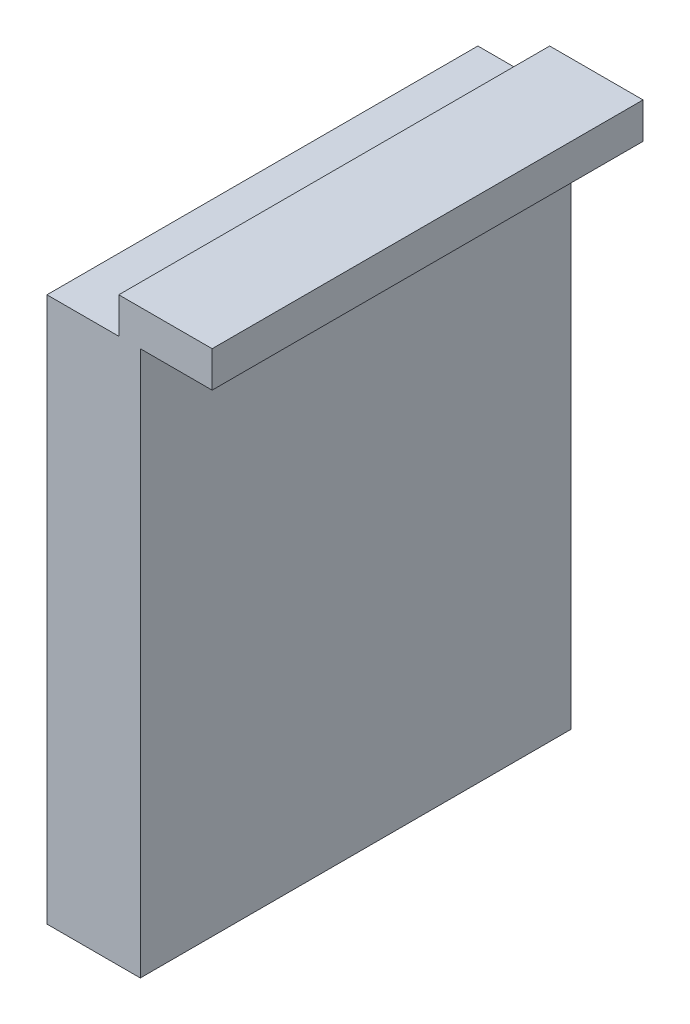
ISO-10303-21;
HEADER;
FILE_DESCRIPTION(('STEP AP214'),'2;1');
FILE_NAME('part.step','',(''),(''),'','','');
FILE_SCHEMA(('AUTOMOTIVE_DESIGN { 1 0 10303 214 1 1 1 1 }'));
ENDSEC;
DATA;
#1=APPLICATION_CONTEXT('core data for automotive mechanical design processes');
#2=APPLICATION_PROTOCOL_DEFINITION('international standard','automotive_design',2000,#1);
#3=PRODUCT_CONTEXT('',#1,'mechanical');
#4=PRODUCT('Part','Part','',(#3));
#5=PRODUCT_RELATED_PRODUCT_CATEGORY('part','',(#4));
#6=PRODUCT_DEFINITION_FORMATION('','',#4);
#7=PRODUCT_DEFINITION_CONTEXT('part definition',#1,'design');
#8=PRODUCT_DEFINITION('design','',#6,#7);
#9=PRODUCT_DEFINITION_SHAPE('','',#8);
#10=(LENGTH_UNIT() NAMED_UNIT(*) SI_UNIT(.MILLI.,.METRE.));
#11=(NAMED_UNIT(*) PLANE_ANGLE_UNIT() SI_UNIT($,.RADIAN.));
#12=(NAMED_UNIT(*) SI_UNIT($,.STERADIAN.) SOLID_ANGLE_UNIT());
#13=UNCERTAINTY_MEASURE_WITH_UNIT(LENGTH_MEASURE(1.E-05),#10,'distance_accuracy_value','');
#14=(GEOMETRIC_REPRESENTATION_CONTEXT(3) GLOBAL_UNCERTAINTY_ASSIGNED_CONTEXT((#13)) GLOBAL_UNIT_ASSIGNED_CONTEXT((#10,
#11,#12)) REPRESENTATION_CONTEXT('',''));
#15=CARTESIAN_POINT('',(0.,0.,0.));
#16=DIRECTION('',(0.,0.,1.));
#17=DIRECTION('',(1.,0.,0.));
#18=AXIS2_PLACEMENT_3D('',#15,#16,#17);
#19=CARTESIAN_POINT('',(-492.563683395295,0.,0.));
#20=DIRECTION('',(-1.,0.,0.));
#21=DIRECTION('',(0.,0.,1.));
#22=AXIS2_PLACEMENT_3D('',#19,#20,#21);
#23=PLANE('',#22);
#24=CARTESIAN_POINT('',(-492.563683395295,153.392316887264,15.));
#25=DIRECTION('',(-1.,0.,0.));
#26=DIRECTION('',(0.,0.,1.));
#27=AXIS2_PLACEMENT_3D('',#24,#25,#26);
#28=CIRCLE('',#27,2.05);
#29=CARTESIAN_POINT('',(-492.563683395295,153.392316887264,17.05));
#30=VERTEX_POINT('',#29);
#31=EDGE_CURVE('E11',#30,#30,#28,.T.);
#32=ORIENTED_EDGE('',*,*,#31,.F.);
#33=EDGE_LOOP('',(#32));
#34=FACE_BOUND('',#33,.T.);
#35=DIRECTION('',(0.,0.,-1.));
#36=VECTOR('',#35,1.);
#37=CARTESIAN_POINT('',(-492.563683395295,171.113943122571,30.));
#38=LINE('',#37,#36);
#39=CARTESIAN_POINT('',(-492.563683395295,171.113943122571,30.));
#40=VERTEX_POINT('',#39);
#41=CARTESIAN_POINT('',(-492.563683395295,171.113943122571,0.));
#42=VERTEX_POINT('',#41);
#43=EDGE_CURVE('E114',#40,#42,#38,.T.);
#44=ORIENTED_EDGE('',*,*,#43,.T.);
#45=DIRECTION('',(0.,-1.,0.));
#46=VECTOR('',#45,1.);
#47=CARTESIAN_POINT('',(-492.563683395295,171.113943122571,0.));
#48=LINE('',#47,#46);
#49=CARTESIAN_POINT('',(-492.563683395295,133.170690651959,0.));
#50=VERTEX_POINT('',#49);
#51=EDGE_CURVE('E108',#42,#50,#48,.T.);
#52=ORIENTED_EDGE('',*,*,#51,.T.);
#53=DIRECTION('',(0.,0.,-1.));
#54=VECTOR('',#53,1.);
#55=CARTESIAN_POINT('',(-492.563683395295,133.170690651959,30.));
#56=LINE('',#55,#54);
#57=CARTESIAN_POINT('',(-492.563683395295,133.170690651959,30.));
#58=VERTEX_POINT('',#57);
#59=EDGE_CURVE('E93',#58,#50,#56,.T.);
#60=ORIENTED_EDGE('',*,*,#59,.F.);
#61=DIRECTION('',(0.,-1.,0.));
#62=VECTOR('',#61,1.);
#63=CARTESIAN_POINT('',(-492.563683395295,171.113943122571,30.));
#64=LINE('',#63,#62);
#65=EDGE_CURVE('E101',#40,#58,#64,.T.);
#66=ORIENTED_EDGE('',*,*,#65,.F.);
#67=EDGE_LOOP('',(#44,#52,#60,#66));
#68=FACE_BOUND('',#67,.T.);
#69=ADVANCED_FACE('F32',(#34,#68),#23,.T.);
#70=CARTESIAN_POINT('',(-439.193337024311,171.113943122571,0.));
#71=DIRECTION('',(0.,0.,-1.));
#72=DIRECTION('',(-1.,0.,0.));
#73=AXIS2_PLACEMENT_3D('',#70,#71,#72);
#74=PLANE('',#73);
#75=DIRECTION('',(-1.,0.,0.));
#76=VECTOR('',#75,1.);
#77=CARTESIAN_POINT('',(-439.193337024311,171.113943122571,0.));
#78=LINE('',#77,#76);
#79=CARTESIAN_POINT('',(-487.563683395295,171.113943122571,0.));
#80=VERTEX_POINT('',#79);
#81=EDGE_CURVE('E36',#80,#42,#78,.T.);
#82=ORIENTED_EDGE('',*,*,#81,.F.);
#83=DIRECTION('',(-1.55100287586667E-13,1.,0.));
#84=VECTOR('',#83,1.);
#85=CARTESIAN_POINT('',(-487.563683395295,173.613943122571,0.));
#86=LINE('',#85,#84);
#87=CARTESIAN_POINT('',(-487.563683395295,173.613943122571,0.));
#88=VERTEX_POINT('',#87);
#89=EDGE_CURVE('E71',#80,#88,#86,.T.);
#90=ORIENTED_EDGE('',*,*,#89,.T.);
#91=DIRECTION('',(-1.,-1.55431223447522E-13,0.));
#92=VECTOR('',#91,1.);
#93=CARTESIAN_POINT('',(-486.063683395295,173.613943122571,0.));
#94=LINE('',#93,#92);
#95=CARTESIAN_POINT('',(-481.063683395295,173.613943122572,0.));
#96=VERTEX_POINT('',#95);
#97=EDGE_CURVE('E116',#96,#88,#94,.T.);
#98=ORIENTED_EDGE('',*,*,#97,.F.);
#99=DIRECTION('',(-1.55431223447524E-13,1.,0.));
#100=VECTOR('',#99,1.);
#101=CARTESIAN_POINT('',(-481.063683395295,173.613943122572,0.));
#102=LINE('',#101,#100);
#103=CARTESIAN_POINT('',(-481.063683395295,171.113943122572,0.));
#104=VERTEX_POINT('',#103);
#105=EDGE_CURVE('E204',#104,#96,#102,.T.);
#106=ORIENTED_EDGE('',*,*,#105,.F.);
#107=DIRECTION('',(-1.,-1.55100287586667E-13,0.));
#108=VECTOR('',#107,1.);
#109=CARTESIAN_POINT('',(-481.063683395295,171.113943122572,0.));
#110=LINE('',#109,#108);
#111=CARTESIAN_POINT('',(-486.063683395295,171.113943122571,0.));
#112=VERTEX_POINT('',#111);
#113=EDGE_CURVE('E206',#104,#112,#110,.T.);
#114=ORIENTED_EDGE('',*,*,#113,.T.);
#115=DIRECTION('',(-1.55100287586667E-13,1.,0.));
#116=VECTOR('',#115,1.);
#117=CARTESIAN_POINT('',(-486.063683395295,173.613943122571,0.));
#118=LINE('',#117,#116);
#119=CARTESIAN_POINT('',(-486.063683395289,133.170690651959,0.));
#120=VERTEX_POINT('',#119);
#121=EDGE_CURVE('E120',#120,#112,#118,.T.);
#122=ORIENTED_EDGE('',*,*,#121,.F.);
#123=DIRECTION('',(-1.,0.,0.));
#124=VECTOR('',#123,1.);
#125=CARTESIAN_POINT('',(-439.193337024311,133.170690651959,0.));
#126=LINE('',#125,#124);
#127=EDGE_CURVE('E98',#120,#50,#126,.T.);
#128=ORIENTED_EDGE('',*,*,#127,.T.);
#129=ORIENTED_EDGE('',*,*,#51,.F.);
#130=EDGE_LOOP('',(#82,#90,#98,#106,#114,#122,#128,#129));
#131=FACE_BOUND('',#130,.T.);
#132=ADVANCED_FACE('F34',(#131),#74,.T.);
#133=CARTESIAN_POINT('',(-439.193337024311,133.170690651959,30.));
#134=DIRECTION('',(0.,1.,0.));
#135=DIRECTION('',(0.,0.,1.));
#136=AXIS2_PLACEMENT_3D('',#133,#134,#135);
#137=PLANE('',#136);
#138=ORIENTED_EDGE('',*,*,#127,.F.);
#139=DIRECTION('',(0.,0.,-1.));
#140=VECTOR('',#139,1.);
#141=CARTESIAN_POINT('',(-486.063683395289,133.170690651959,30.));
#142=LINE('',#141,#140);
#143=CARTESIAN_POINT('',(-486.063683395289,133.170690651959,30.));
#144=VERTEX_POINT('',#143);
#145=EDGE_CURVE('E96',#144,#120,#142,.T.);
#146=ORIENTED_EDGE('',*,*,#145,.F.);
#147=DIRECTION('',(-1.,0.,0.));
#148=VECTOR('',#147,1.);
#149=CARTESIAN_POINT('',(-439.193337024311,133.170690651959,30.));
#150=LINE('',#149,#148);
#151=EDGE_CURVE('E89',#144,#58,#150,.T.);
#152=ORIENTED_EDGE('',*,*,#151,.T.);
#153=ORIENTED_EDGE('',*,*,#59,.T.);
#154=EDGE_LOOP('',(#138,#146,#152,#153));
#155=FACE_BOUND('',#154,.T.);
#156=ADVANCED_FACE('F91',(#155),#137,.F.);
#157=CARTESIAN_POINT('',(-439.193337024311,171.113943122571,30.));
#158=DIRECTION('',(0.,0.,-1.));
#159=DIRECTION('',(0.,1.,0.));
#160=AXIS2_PLACEMENT_3D('',#157,#158,#159);
#161=PLANE('',#160);
#162=ORIENTED_EDGE('',*,*,#151,.F.);
#163=DIRECTION('',(1.55100287586667E-13,-1.,0.));
#164=VECTOR('',#163,1.);
#165=CARTESIAN_POINT('',(-486.063683395295,173.613943122571,30.));
#166=LINE('',#165,#164);
#167=CARTESIAN_POINT('',(-486.063683395295,171.113943122571,30.));
#168=VERTEX_POINT('',#167);
#169=EDGE_CURVE('E123',#168,#144,#166,.T.);
#170=ORIENTED_EDGE('',*,*,#169,.F.);
#171=DIRECTION('',(-1.,-1.55100287586667E-13,0.));
#172=VECTOR('',#171,1.);
#173=CARTESIAN_POINT('',(-481.063683395295,171.113943122572,30.));
#174=LINE('',#173,#172);
#175=CARTESIAN_POINT('',(-481.063683395295,171.113943122572,30.));
#176=VERTEX_POINT('',#175);
#177=EDGE_CURVE('E133',#176,#168,#174,.T.);
#178=ORIENTED_EDGE('',*,*,#177,.F.);
#179=DIRECTION('',(1.55431223447524E-13,-1.,0.));
#180=VECTOR('',#179,1.);
#181=CARTESIAN_POINT('',(-481.063683395295,173.613943122572,30.));
#182=LINE('',#181,#180);
#183=CARTESIAN_POINT('',(-481.063683395295,173.613943122572,30.));
#184=VERTEX_POINT('',#183);
#185=EDGE_CURVE('E196',#184,#176,#182,.T.);
#186=ORIENTED_EDGE('',*,*,#185,.F.);
#187=DIRECTION('',(-1.,-1.55431223447522E-13,0.));
#188=VECTOR('',#187,1.);
#189=CARTESIAN_POINT('',(-486.063683395295,173.613943122571,30.));
#190=LINE('',#189,#188);
#191=CARTESIAN_POINT('',(-487.563683395295,173.613943122571,30.));
#192=VERTEX_POINT('',#191);
#193=EDGE_CURVE('E125',#184,#192,#190,.T.);
#194=ORIENTED_EDGE('',*,*,#193,.T.);
#195=DIRECTION('',(1.55100287586667E-13,-1.,0.));
#196=VECTOR('',#195,1.);
#197=CARTESIAN_POINT('',(-487.563683395295,173.613943122571,30.));
#198=LINE('',#197,#196);
#199=CARTESIAN_POINT('',(-487.563683395295,171.113943122571,30.));
#200=VERTEX_POINT('',#199);
#201=EDGE_CURVE('E131',#192,#200,#198,.T.);
#202=ORIENTED_EDGE('',*,*,#201,.T.);
#203=DIRECTION('',(-1.,0.,0.));
#204=VECTOR('',#203,1.);
#205=CARTESIAN_POINT('',(-439.193337024311,171.113943122571,30.));
#206=LINE('',#205,#204);
#207=EDGE_CURVE('E104',#200,#40,#206,.T.);
#208=ORIENTED_EDGE('',*,*,#207,.T.);
#209=ORIENTED_EDGE('',*,*,#65,.T.);
#210=EDGE_LOOP('',(#162,#170,#178,#186,#194,#202,#208,#209));
#211=FACE_BOUND('',#210,.T.);
#212=ADVANCED_FACE('F102',(#211),#161,.F.);
#213=CARTESIAN_POINT('',(-439.193337024311,171.113943122571,30.));
#214=DIRECTION('',(0.,1.,0.));
#215=DIRECTION('',(0.,0.,1.));
#216=AXIS2_PLACEMENT_3D('',#213,#214,#215);
#217=PLANE('',#216);
#218=ORIENTED_EDGE('',*,*,#207,.F.);
#219=DIRECTION('',(0.,0.,-1.));
#220=VECTOR('',#219,1.);
#221=CARTESIAN_POINT('',(-487.563683395295,171.113943122571,30.));
#222=LINE('',#221,#220);
#223=EDGE_CURVE('E76',#200,#80,#222,.T.);
#224=ORIENTED_EDGE('',*,*,#223,.T.);
#225=ORIENTED_EDGE('',*,*,#81,.T.);
#226=ORIENTED_EDGE('',*,*,#43,.F.);
#227=EDGE_LOOP('',(#218,#224,#225,#226));
#228=FACE_BOUND('',#227,.T.);
#229=ADVANCED_FACE('F153',(#228),#217,.T.);
#230=CARTESIAN_POINT('',(-486.063683395295,173.613943122571,30.));
#231=DIRECTION('',(1.55431223447522E-13,-1.,0.));
#232=DIRECTION('',(1.,1.55431223447522E-13,0.));
#233=AXIS2_PLACEMENT_3D('',#230,#231,#232);
#234=PLANE('',#233);
#235=DIRECTION('',(0.,0.,1.));
#236=VECTOR('',#235,1.);
#237=CARTESIAN_POINT('',(-487.563683395295,173.613943122571,30.));
#238=LINE('',#237,#236);
#239=EDGE_CURVE('E127',#88,#192,#238,.T.);
#240=ORIENTED_EDGE('',*,*,#239,.T.);
#241=ORIENTED_EDGE('',*,*,#193,.F.);
#242=DIRECTION('',(0.,0.,1.));
#243=VECTOR('',#242,1.);
#244=CARTESIAN_POINT('',(-481.063683395295,173.613943122572,30.));
#245=LINE('',#244,#243);
#246=EDGE_CURVE('E147',#96,#184,#245,.T.);
#247=ORIENTED_EDGE('',*,*,#246,.F.);
#248=ORIENTED_EDGE('',*,*,#97,.T.);
#249=EDGE_LOOP('',(#240,#241,#247,#248));
#250=FACE_BOUND('',#249,.T.);
#251=ADVANCED_FACE('F143',(#250),#234,.F.);
#252=CARTESIAN_POINT('',(-486.063683395268,-7.53881206762493E-11,0.));
#253=DIRECTION('',(1.,1.55100287586667E-13,0.));
#254=DIRECTION('',(-1.55100287586667E-13,1.,0.));
#255=AXIS2_PLACEMENT_3D('',#252,#253,#254);
#256=PLANE('',#255);
#257=DIRECTION('',(0.,0.,-1.));
#258=VECTOR('',#257,1.);
#259=CARTESIAN_POINT('',(-486.063683395295,171.113943122571,30.));
#260=LINE('',#259,#258);
#261=EDGE_CURVE('E48',#168,#112,#260,.T.);
#262=ORIENTED_EDGE('',*,*,#261,.F.);
#263=ORIENTED_EDGE('',*,*,#169,.T.);
#264=ORIENTED_EDGE('',*,*,#145,.T.);
#265=ORIENTED_EDGE('',*,*,#121,.T.);
#266=EDGE_LOOP('',(#262,#263,#264,#265));
#267=FACE_BOUND('',#266,.T.);
#268=ADVANCED_FACE('F121',(#267),#256,.T.);
#269=CARTESIAN_POINT('',(-487.563683395268,-7.56212675114206E-11,0.));
#270=DIRECTION('',(1.,1.55100287586667E-13,0.));
#271=DIRECTION('',(-1.55100287586667E-13,1.,0.));
#272=AXIS2_PLACEMENT_3D('',#269,#270,#271);
#273=PLANE('',#272);
#274=ORIENTED_EDGE('',*,*,#223,.F.);
#275=ORIENTED_EDGE('',*,*,#201,.F.);
#276=ORIENTED_EDGE('',*,*,#239,.F.);
#277=ORIENTED_EDGE('',*,*,#89,.F.);
#278=EDGE_LOOP('',(#274,#275,#276,#277));
#279=FACE_BOUND('',#278,.T.);
#280=ADVANCED_FACE('F151',(#279),#273,.F.);
#281=CARTESIAN_POINT('',(-481.063683395295,171.113943122572,30.));
#282=DIRECTION('',(-1.55100287586667E-13,1.,0.));
#283=DIRECTION('',(-1.,-1.55100287586667E-13,0.));
#284=AXIS2_PLACEMENT_3D('',#281,#282,#283);
#285=PLANE('',#284);
#286=ORIENTED_EDGE('',*,*,#261,.T.);
#287=ORIENTED_EDGE('',*,*,#113,.F.);
#288=DIRECTION('',(0.,0.,-1.));
#289=VECTOR('',#288,1.);
#290=CARTESIAN_POINT('',(-481.063683395295,171.113943122572,30.));
#291=LINE('',#290,#289);
#292=EDGE_CURVE('E201',#176,#104,#291,.T.);
#293=ORIENTED_EDGE('',*,*,#292,.F.);
#294=ORIENTED_EDGE('',*,*,#177,.T.);
#295=EDGE_LOOP('',(#286,#287,#293,#294));
#296=FACE_BOUND('',#295,.T.);
#297=ADVANCED_FACE('F172',(#296),#285,.F.);
#298=CARTESIAN_POINT('',(-481.063683395268,-7.47739715456029E-11,0.));
#299=DIRECTION('',(1.,1.55431223447524E-13,0.));
#300=DIRECTION('',(-1.55431223447524E-13,1.,0.));
#301=AXIS2_PLACEMENT_3D('',#298,#299,#300);
#302=PLANE('',#301);
#303=ORIENTED_EDGE('',*,*,#185,.T.);
#304=ORIENTED_EDGE('',*,*,#292,.T.);
#305=ORIENTED_EDGE('',*,*,#105,.T.);
#306=ORIENTED_EDGE('',*,*,#246,.T.);
#307=EDGE_LOOP('',(#303,#304,#305,#306));
#308=FACE_BOUND('',#307,.T.);
#309=ADVANCED_FACE('F177',(#308),#302,.T.);
#310=CARTESIAN_POINT('',(-495.063683395292,153.392316887264,15.));
#311=DIRECTION('',(1.,1.55100287586667E-13,0.));
#312=DIRECTION('',(-1.55100287586667E-13,1.,0.));
#313=AXIS2_PLACEMENT_3D('',#310,#311,#312);
#314=CYLINDRICAL_SURFACE('',#313,2.05);
#315=ORIENTED_EDGE('',*,*,#31,.T.);
#316=EDGE_LOOP('',(#315));
#317=FACE_BOUND('',#316,.T.);
#318=CARTESIAN_POINT('',(-495.063683395292,153.392316887264,15.));
#319=DIRECTION('',(1.,1.55100287586667E-13,0.));
#320=DIRECTION('',(-1.55100287586667E-13,1.,0.));
#321=AXIS2_PLACEMENT_3D('',#318,#319,#320);
#322=CIRCLE('',#321,2.05);
#323=CARTESIAN_POINT('',(-495.063683395292,155.442316887264,15.));
#324=VERTEX_POINT('',#323);
#325=EDGE_CURVE('E193',#324,#324,#322,.T.);
#326=ORIENTED_EDGE('',*,*,#325,.T.);
#327=EDGE_LOOP('',(#326));
#328=FACE_BOUND('',#327,.T.);
#329=ADVANCED_FACE('F181',(#317,#328),#314,.T.);
#330=CARTESIAN_POINT('',(-495.063683395292,153.392316887264,15.));
#331=DIRECTION('',(1.,1.55100287586667E-13,0.));
#332=DIRECTION('',(-1.55100287586667E-13,1.,0.));
#333=AXIS2_PLACEMENT_3D('',#330,#331,#332);
#334=PLANE('',#333);
#335=ORIENTED_EDGE('',*,*,#325,.F.);
#336=EDGE_LOOP('',(#335));
#337=FACE_BOUND('',#336,.T.);
#338=ADVANCED_FACE('F185',(#337),#334,.F.);
#339=CLOSED_SHELL('',(#69,#132,#156,#212,#229,#251,#268,#280,#297,#309,#329,#338));
#340=MANIFOLD_SOLID_BREP('B2',#339);
#341=ADVANCED_BREP_SHAPE_REPRESENTATION('',(#18,#340),#14);
#342=SHAPE_DEFINITION_REPRESENTATION(#9,#341);
ENDSEC;
END-ISO-10303-21;
